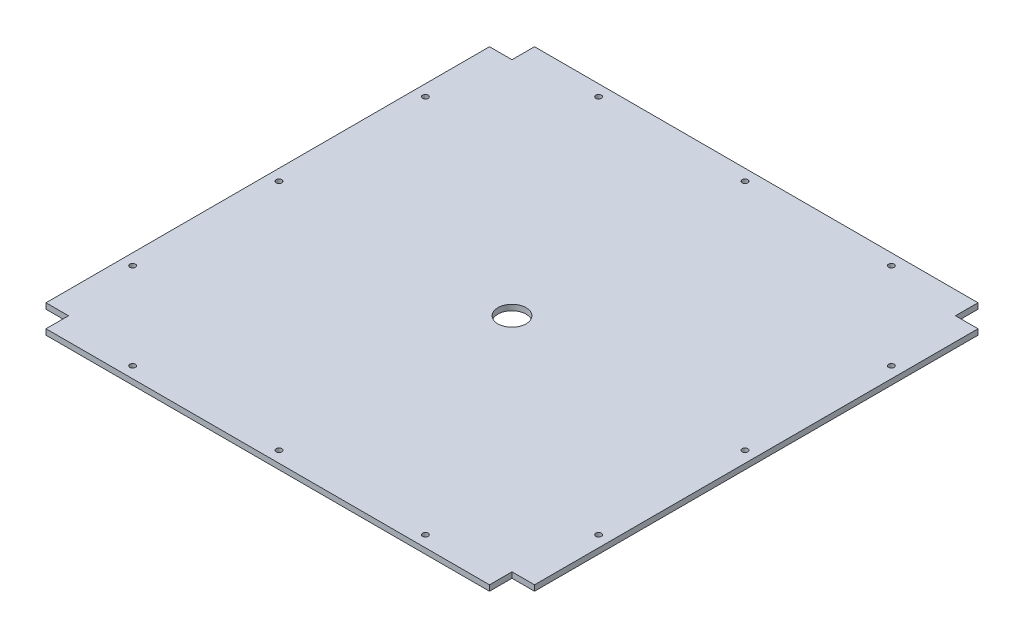
ISO-10303-21;
HEADER;
FILE_DESCRIPTION(('STEP AP214'),'2;1');
FILE_NAME('part.step','',(''),(''),'','','');
FILE_SCHEMA(('AUTOMOTIVE_DESIGN { 1 0 10303 214 1 1 1 1 }'));
ENDSEC;
DATA;
#1=APPLICATION_CONTEXT('core data for automotive mechanical design processes');
#2=APPLICATION_PROTOCOL_DEFINITION('international standard','automotive_design',2000,#1);
#3=PRODUCT_CONTEXT('',#1,'mechanical');
#4=PRODUCT('Part','Part','',(#3));
#5=PRODUCT_RELATED_PRODUCT_CATEGORY('part','',(#4));
#6=PRODUCT_DEFINITION_FORMATION('','',#4);
#7=PRODUCT_DEFINITION_CONTEXT('part definition',#1,'design');
#8=PRODUCT_DEFINITION('design','',#6,#7);
#9=PRODUCT_DEFINITION_SHAPE('','',#8);
#10=(LENGTH_UNIT() NAMED_UNIT(*) SI_UNIT(.MILLI.,.METRE.));
#11=(NAMED_UNIT(*) PLANE_ANGLE_UNIT() SI_UNIT($,.RADIAN.));
#12=(NAMED_UNIT(*) SI_UNIT($,.STERADIAN.) SOLID_ANGLE_UNIT());
#13=UNCERTAINTY_MEASURE_WITH_UNIT(LENGTH_MEASURE(1.E-05),#10,'distance_accuracy_value','');
#14=(GEOMETRIC_REPRESENTATION_CONTEXT(3) GLOBAL_UNCERTAINTY_ASSIGNED_CONTEXT((#13)) GLOBAL_UNIT_ASSIGNED_CONTEXT((#10,
#11,#12)) REPRESENTATION_CONTEXT('',''));
#15=CARTESIAN_POINT('',(0.,0.,0.));
#16=DIRECTION('',(0.,0.,1.));
#17=DIRECTION('',(1.,0.,0.));
#18=AXIS2_PLACEMENT_3D('',#15,#16,#17);
#19=CARTESIAN_POINT('',(0.,5.,0.));
#20=DIRECTION('',(0.,1.,0.));
#21=DIRECTION('',(0.,0.,1.));
#22=AXIS2_PLACEMENT_3D('',#19,#20,#21);
#23=PLANE('',#22);
#24=CARTESIAN_POINT('',(0.,5.,0.));
#25=DIRECTION('',(0.,1.,0.));
#26=DIRECTION('',(0.,0.,1.));
#27=AXIS2_PLACEMENT_3D('',#24,#25,#26);
#28=CIRCLE('',#27,12.5);
#29=CARTESIAN_POINT('',(0.,5.,12.5));
#30=VERTEX_POINT('',#29);
#31=EDGE_CURVE('E234',#30,#30,#28,.T.);
#32=ORIENTED_EDGE('',*,*,#31,.F.);
#33=EDGE_LOOP('',(#32));
#34=FACE_BOUND('',#33,.T.);
#35=CARTESIAN_POINT('',(-6.39469910293642E-13,5.,207.));
#36=DIRECTION('',(0.,-1.,0.));
#37=DIRECTION('',(0.,0.,-1.));
#38=AXIS2_PLACEMENT_3D('',#35,#36,#37);
#39=CIRCLE('',#38,2.5);
#40=CARTESIAN_POINT('',(-6.39469910293642E-13,5.,204.5));
#41=VERTEX_POINT('',#40);
#42=EDGE_CURVE('E275',#41,#41,#39,.T.);
#43=ORIENTED_EDGE('',*,*,#42,.T.);
#44=EDGE_LOOP('',(#43));
#45=FACE_BOUND('',#44,.T.);
#46=CARTESIAN_POINT('',(129.999999999999,5.,207.000000000001));
#47=DIRECTION('',(0.,-1.,0.));
#48=DIRECTION('',(0.,0.,-1.));
#49=AXIS2_PLACEMENT_3D('',#46,#47,#48);
#50=CIRCLE('',#49,2.5);
#51=CARTESIAN_POINT('',(129.999999999999,5.,204.500000000001));
#52=VERTEX_POINT('',#51);
#53=EDGE_CURVE('E283',#52,#52,#50,.T.);
#54=ORIENTED_EDGE('',*,*,#53,.T.);
#55=EDGE_LOOP('',(#54));
#56=FACE_BOUND('',#55,.T.);
#57=CARTESIAN_POINT('',(207.,5.,0.));
#58=DIRECTION('',(0.,-1.,0.));
#59=DIRECTION('',(0.,0.,-1.));
#60=AXIS2_PLACEMENT_3D('',#57,#58,#59);
#61=CIRCLE('',#60,2.5);
#62=CARTESIAN_POINT('',(207.,5.,-2.50000000000008));
#63=VERTEX_POINT('',#62);
#64=EDGE_CURVE('E299',#63,#63,#61,.T.);
#65=ORIENTED_EDGE('',*,*,#64,.T.);
#66=EDGE_LOOP('',(#65));
#67=FACE_BOUND('',#66,.T.);
#68=CARTESIAN_POINT('',(207.,5.,-130.));
#69=DIRECTION('',(0.,-1.,0.));
#70=DIRECTION('',(0.,0.,-1.));
#71=AXIS2_PLACEMENT_3D('',#68,#69,#70);
#72=CIRCLE('',#71,2.5);
#73=CARTESIAN_POINT('',(207.,5.,-132.5));
#74=VERTEX_POINT('',#73);
#75=EDGE_CURVE('E307',#74,#74,#72,.T.);
#76=ORIENTED_EDGE('',*,*,#75,.T.);
#77=EDGE_LOOP('',(#76));
#78=FACE_BOUND('',#77,.T.);
#79=CARTESIAN_POINT('',(-129.999999999999,5.,-207.000000000001));
#80=DIRECTION('',(0.,-1.,0.));
#81=DIRECTION('',(0.,0.,-1.));
#82=AXIS2_PLACEMENT_3D('',#79,#80,#81);
#83=CIRCLE('',#82,2.5);
#84=CARTESIAN_POINT('',(-129.999999999999,5.,-209.500000000001));
#85=VERTEX_POINT('',#84);
#86=EDGE_CURVE('E243',#85,#85,#83,.T.);
#87=ORIENTED_EDGE('',*,*,#86,.T.);
#88=EDGE_LOOP('',(#87));
#89=FACE_BOUND('',#88,.T.);
#90=CARTESIAN_POINT('',(-207.,5.,130.));
#91=DIRECTION('',(0.,-1.,0.));
#92=DIRECTION('',(0.,0.,-1.));
#93=AXIS2_PLACEMENT_3D('',#90,#91,#92);
#94=CIRCLE('',#93,2.5);
#95=CARTESIAN_POINT('',(-207.,5.,127.5));
#96=VERTEX_POINT('',#95);
#97=EDGE_CURVE('E173',#96,#96,#94,.T.);
#98=ORIENTED_EDGE('',*,*,#97,.T.);
#99=EDGE_LOOP('',(#98));
#100=FACE_BOUND('',#99,.T.);
#101=CARTESIAN_POINT('',(-207.,5.,0.));
#102=DIRECTION('',(0.,1.,0.));
#103=DIRECTION('',(0.,0.,1.));
#104=AXIS2_PLACEMENT_3D('',#101,#102,#103);
#105=CIRCLE('',#104,2.5);
#106=CARTESIAN_POINT('',(-207.,5.,2.49999999999991));
#107=VERTEX_POINT('',#106);
#108=EDGE_CURVE('E260',#107,#107,#105,.T.);
#109=ORIENTED_EDGE('',*,*,#108,.F.);
#110=EDGE_LOOP('',(#109));
#111=FACE_BOUND('',#110,.T.);
#112=CARTESIAN_POINT('',(-207.,5.,-130.));
#113=DIRECTION('',(0.,1.,0.));
#114=DIRECTION('',(0.,0.,1.));
#115=AXIS2_PLACEMENT_3D('',#112,#113,#114);
#116=CIRCLE('',#115,2.5);
#117=CARTESIAN_POINT('',(-207.,5.,-127.5));
#118=VERTEX_POINT('',#117);
#119=EDGE_CURVE('E252',#118,#118,#116,.T.);
#120=ORIENTED_EDGE('',*,*,#119,.F.);
#121=EDGE_LOOP('',(#120));
#122=FACE_BOUND('',#121,.T.);
#123=CARTESIAN_POINT('',(8.06003363987416E-13,5.,-207.));
#124=DIRECTION('',(0.,1.,0.));
#125=DIRECTION('',(0.,0.,1.));
#126=AXIS2_PLACEMENT_3D('',#123,#124,#125);
#127=CIRCLE('',#126,2.49999999999999);
#128=CARTESIAN_POINT('',(8.06003363987416E-13,5.,-204.5));
#129=VERTEX_POINT('',#128);
#130=EDGE_CURVE('E323',#129,#129,#127,.T.);
#131=ORIENTED_EDGE('',*,*,#130,.F.);
#132=EDGE_LOOP('',(#131));
#133=FACE_BOUND('',#132,.T.);
#134=CARTESIAN_POINT('',(130.000000000001,5.,-207.));
#135=DIRECTION('',(0.,1.,0.));
#136=DIRECTION('',(0.,0.,1.));
#137=AXIS2_PLACEMENT_3D('',#134,#135,#136);
#138=CIRCLE('',#137,2.5);
#139=CARTESIAN_POINT('',(130.000000000001,5.,-204.5));
#140=VERTEX_POINT('',#139);
#141=EDGE_CURVE('E315',#140,#140,#138,.T.);
#142=ORIENTED_EDGE('',*,*,#141,.F.);
#143=EDGE_LOOP('',(#142));
#144=FACE_BOUND('',#143,.T.);
#145=CARTESIAN_POINT('',(207.,5.,130.));
#146=DIRECTION('',(0.,1.,0.));
#147=DIRECTION('',(0.,0.,1.));
#148=AXIS2_PLACEMENT_3D('',#145,#146,#147);
#149=CIRCLE('',#148,2.5);
#150=CARTESIAN_POINT('',(207.,5.,132.5));
#151=VERTEX_POINT('',#150);
#152=EDGE_CURVE('E291',#151,#151,#149,.T.);
#153=ORIENTED_EDGE('',*,*,#152,.F.);
#154=EDGE_LOOP('',(#153));
#155=FACE_BOUND('',#154,.T.);
#156=CARTESIAN_POINT('',(-130.000000000001,5.,207.));
#157=DIRECTION('',(0.,1.,0.));
#158=DIRECTION('',(0.,0.,1.));
#159=AXIS2_PLACEMENT_3D('',#156,#157,#158);
#160=CIRCLE('',#159,2.5);
#161=CARTESIAN_POINT('',(-130.000000000001,5.,209.5));
#162=VERTEX_POINT('',#161);
#163=EDGE_CURVE('E267',#162,#162,#160,.T.);
#164=ORIENTED_EDGE('',*,*,#163,.F.);
#165=EDGE_LOOP('',(#164));
#166=FACE_BOUND('',#165,.T.);
#167=DIRECTION('',(0.,0.,1.));
#168=VECTOR('',#167,1.);
#169=CARTESIAN_POINT('',(-217.,5.,-217.));
#170=LINE('',#169,#168);
#171=CARTESIAN_POINT('',(-217.,5.,-197.));
#172=VERTEX_POINT('',#171);
#173=CARTESIAN_POINT('',(-217.,5.,196.999999999998));
#174=VERTEX_POINT('',#173);
#175=EDGE_CURVE('E167',#172,#174,#170,.T.);
#176=ORIENTED_EDGE('',*,*,#175,.T.);
#177=DIRECTION('',(1.,0.,0.));
#178=VECTOR('',#177,1.);
#179=CARTESIAN_POINT('',(-2.18713935851156E-12,5.,197.));
#180=LINE('',#179,#178);
#181=CARTESIAN_POINT('',(-197.000000000002,5.,196.999999999998));
#182=VERTEX_POINT('',#181);
#183=EDGE_CURVE('E394',#174,#182,#180,.T.);
#184=ORIENTED_EDGE('',*,*,#183,.T.);
#185=DIRECTION('',(0.,0.,-1.));
#186=VECTOR('',#185,1.);
#187=CARTESIAN_POINT('',(-197.,5.,-2.18713935851156E-12));
#188=LINE('',#187,#186);
#189=CARTESIAN_POINT('',(-197.000000000002,5.,217.));
#190=VERTEX_POINT('',#189);
#191=EDGE_CURVE('E398',#190,#182,#188,.T.);
#192=ORIENTED_EDGE('',*,*,#191,.F.);
#193=DIRECTION('',(1.,0.,0.));
#194=VECTOR('',#193,1.);
#195=CARTESIAN_POINT('',(-217.,5.,217.));
#196=LINE('',#195,#194);
#197=CARTESIAN_POINT('',(196.999999999999,5.,217.));
#198=VERTEX_POINT('',#197);
#199=EDGE_CURVE('E178',#190,#198,#196,.T.);
#200=ORIENTED_EDGE('',*,*,#199,.T.);
#201=DIRECTION('',(0.,0.,-1.));
#202=VECTOR('',#201,1.);
#203=CARTESIAN_POINT('',(197.,5.,1.36696209906973E-12));
#204=LINE('',#203,#202);
#205=CARTESIAN_POINT('',(196.999999999999,5.,197.000000000001));
#206=VERTEX_POINT('',#205);
#207=EDGE_CURVE('E383',#198,#206,#204,.T.);
#208=ORIENTED_EDGE('',*,*,#207,.T.);
#209=DIRECTION('',(-1.,0.,0.));
#210=VECTOR('',#209,1.);
#211=CARTESIAN_POINT('',(-1.36696209906973E-12,5.,197.));
#212=LINE('',#211,#210);
#213=CARTESIAN_POINT('',(217.,5.,197.000000000002));
#214=VERTEX_POINT('',#213);
#215=EDGE_CURVE('E159',#214,#206,#212,.T.);
#216=ORIENTED_EDGE('',*,*,#215,.F.);
#217=DIRECTION('',(0.,0.,-1.));
#218=VECTOR('',#217,1.);
#219=CARTESIAN_POINT('',(217.,5.,-217.));
#220=LINE('',#219,#218);
#221=CARTESIAN_POINT('',(217.,5.,-196.999999999999));
#222=VERTEX_POINT('',#221);
#223=EDGE_CURVE('E150',#214,#222,#220,.T.);
#224=ORIENTED_EDGE('',*,*,#223,.T.);
#225=DIRECTION('',(-1.,0.,0.));
#226=VECTOR('',#225,1.);
#227=CARTESIAN_POINT('',(5.4678483962789E-13,5.,-197.));
#228=LINE('',#227,#226);
#229=CARTESIAN_POINT('',(197.000000000001,5.,-196.999999999999));
#230=VERTEX_POINT('',#229);
#231=EDGE_CURVE('E132',#222,#230,#228,.T.);
#232=ORIENTED_EDGE('',*,*,#231,.T.);
#233=DIRECTION('',(0.,0.,1.));
#234=VECTOR('',#233,1.);
#235=CARTESIAN_POINT('',(197.,5.,5.46784839627891E-13));
#236=LINE('',#235,#234);
#237=CARTESIAN_POINT('',(197.000000000001,5.,-217.));
#238=VERTEX_POINT('',#237);
#239=EDGE_CURVE('E143',#238,#230,#236,.T.);
#240=ORIENTED_EDGE('',*,*,#239,.F.);
#241=DIRECTION('',(-1.,0.,0.));
#242=VECTOR('',#241,1.);
#243=CARTESIAN_POINT('',(-217.,5.,-217.));
#244=LINE('',#243,#242);
#245=CARTESIAN_POINT('',(-197.,5.,-217.));
#246=VERTEX_POINT('',#245);
#247=EDGE_CURVE('E161',#238,#246,#244,.T.);
#248=ORIENTED_EDGE('',*,*,#247,.T.);
#249=DIRECTION('',(0.,0.,1.));
#250=VECTOR('',#249,1.);
#251=CARTESIAN_POINT('',(-197.,5.,0.));
#252=LINE('',#251,#250);
#253=CARTESIAN_POINT('',(-197.,5.,-197.));
#254=VERTEX_POINT('',#253);
#255=EDGE_CURVE('E377',#246,#254,#252,.T.);
#256=ORIENTED_EDGE('',*,*,#255,.T.);
#257=DIRECTION('',(1.,0.,0.));
#258=VECTOR('',#257,1.);
#259=CARTESIAN_POINT('',(0.,5.,-197.));
#260=LINE('',#259,#258);
#261=EDGE_CURVE('E409',#172,#254,#260,.T.);
#262=ORIENTED_EDGE('',*,*,#261,.F.);
#263=EDGE_LOOP('',(#176,#184,#192,#200,#208,#216,#224,#232,#240,#248,#256,#262));
#264=FACE_BOUND('',#263,.T.);
#265=ADVANCED_FACE('F42',(#34,#45,#56,#67,#78,#89,#100,#111,#122,#133,#144,#155,#166,#264),#23,.T.);
#266=CARTESIAN_POINT('',(0.,0.,0.));
#267=DIRECTION('',(0.,1.,0.));
#268=DIRECTION('',(0.,0.,1.));
#269=AXIS2_PLACEMENT_3D('',#266,#267,#268);
#270=PLANE('',#269);
#271=CARTESIAN_POINT('',(0.,0.,0.));
#272=DIRECTION('',(0.,1.,0.));
#273=DIRECTION('',(0.,0.,1.));
#274=AXIS2_PLACEMENT_3D('',#271,#272,#273);
#275=CIRCLE('',#274,12.5);
#276=CARTESIAN_POINT('',(0.,0.,12.5));
#277=VERTEX_POINT('',#276);
#278=EDGE_CURVE('E235',#277,#277,#275,.T.);
#279=ORIENTED_EDGE('',*,*,#278,.T.);
#280=EDGE_LOOP('',(#279));
#281=FACE_BOUND('',#280,.T.);
#282=CARTESIAN_POINT('',(207.,0.,130.));
#283=DIRECTION('',(0.,1.,0.));
#284=DIRECTION('',(0.,0.,1.));
#285=AXIS2_PLACEMENT_3D('',#282,#283,#284);
#286=CIRCLE('',#285,2.5);
#287=CARTESIAN_POINT('',(207.,0.,132.5));
#288=VERTEX_POINT('',#287);
#289=EDGE_CURVE('E295',#288,#288,#286,.T.);
#290=ORIENTED_EDGE('',*,*,#289,.T.);
#291=EDGE_LOOP('',(#290));
#292=FACE_BOUND('',#291,.T.);
#293=CARTESIAN_POINT('',(207.,0.,0.));
#294=DIRECTION('',(0.,-1.,0.));
#295=DIRECTION('',(0.,0.,-1.));
#296=AXIS2_PLACEMENT_3D('',#293,#294,#295);
#297=CIRCLE('',#296,2.5);
#298=CARTESIAN_POINT('',(207.,0.,-2.50000000000008));
#299=VERTEX_POINT('',#298);
#300=EDGE_CURVE('E303',#299,#299,#297,.T.);
#301=ORIENTED_EDGE('',*,*,#300,.F.);
#302=EDGE_LOOP('',(#301));
#303=FACE_BOUND('',#302,.T.);
#304=CARTESIAN_POINT('',(207.,0.,-130.));
#305=DIRECTION('',(0.,-1.,0.));
#306=DIRECTION('',(0.,0.,-1.));
#307=AXIS2_PLACEMENT_3D('',#304,#305,#306);
#308=CIRCLE('',#307,2.5);
#309=CARTESIAN_POINT('',(207.,0.,-132.5));
#310=VERTEX_POINT('',#309);
#311=EDGE_CURVE('E311',#310,#310,#308,.T.);
#312=ORIENTED_EDGE('',*,*,#311,.F.);
#313=EDGE_LOOP('',(#312));
#314=FACE_BOUND('',#313,.T.);
#315=CARTESIAN_POINT('',(8.06003363987416E-13,0.,-207.));
#316=DIRECTION('',(0.,1.,0.));
#317=DIRECTION('',(0.,0.,1.));
#318=AXIS2_PLACEMENT_3D('',#315,#316,#317);
#319=CIRCLE('',#318,2.49999999999999);
#320=CARTESIAN_POINT('',(8.06003363987416E-13,0.,-204.5));
#321=VERTEX_POINT('',#320);
#322=EDGE_CURVE('E247',#321,#321,#319,.T.);
#323=ORIENTED_EDGE('',*,*,#322,.T.);
#324=EDGE_LOOP('',(#323));
#325=FACE_BOUND('',#324,.T.);
#326=CARTESIAN_POINT('',(-129.999999999999,0.,-207.000000000001));
#327=DIRECTION('',(0.,-1.,0.));
#328=DIRECTION('',(0.,0.,-1.));
#329=AXIS2_PLACEMENT_3D('',#326,#327,#328);
#330=CIRCLE('',#329,2.5);
#331=CARTESIAN_POINT('',(-129.999999999999,0.,-209.500000000001));
#332=VERTEX_POINT('',#331);
#333=EDGE_CURVE('E248',#332,#332,#330,.T.);
#334=ORIENTED_EDGE('',*,*,#333,.F.);
#335=EDGE_LOOP('',(#334));
#336=FACE_BOUND('',#335,.T.);
#337=CARTESIAN_POINT('',(-207.,0.,0.));
#338=DIRECTION('',(0.,1.,0.));
#339=DIRECTION('',(0.,0.,1.));
#340=AXIS2_PLACEMENT_3D('',#337,#338,#339);
#341=CIRCLE('',#340,2.5);
#342=CARTESIAN_POINT('',(-207.,0.,2.49999999999991));
#343=VERTEX_POINT('',#342);
#344=EDGE_CURVE('E239',#343,#343,#341,.T.);
#345=ORIENTED_EDGE('',*,*,#344,.T.);
#346=EDGE_LOOP('',(#345));
#347=FACE_BOUND('',#346,.T.);
#348=CARTESIAN_POINT('',(-207.,0.,130.));
#349=DIRECTION('',(0.,-1.,0.));
#350=DIRECTION('',(0.,0.,-1.));
#351=AXIS2_PLACEMENT_3D('',#348,#349,#350);
#352=CIRCLE('',#351,2.5);
#353=CARTESIAN_POINT('',(-207.,0.,127.5));
#354=VERTEX_POINT('',#353);
#355=EDGE_CURVE('E186',#354,#354,#352,.T.);
#356=ORIENTED_EDGE('',*,*,#355,.F.);
#357=EDGE_LOOP('',(#356));
#358=FACE_BOUND('',#357,.T.);
#359=CARTESIAN_POINT('',(-207.,0.,-130.));
#360=DIRECTION('',(0.,1.,0.));
#361=DIRECTION('',(0.,0.,1.));
#362=AXIS2_PLACEMENT_3D('',#359,#360,#361);
#363=CIRCLE('',#362,2.5);
#364=CARTESIAN_POINT('',(-207.,0.,-127.5));
#365=VERTEX_POINT('',#364);
#366=EDGE_CURVE('E256',#365,#365,#363,.T.);
#367=ORIENTED_EDGE('',*,*,#366,.T.);
#368=EDGE_LOOP('',(#367));
#369=FACE_BOUND('',#368,.T.);
#370=CARTESIAN_POINT('',(130.000000000001,0.,-207.));
#371=DIRECTION('',(0.,1.,0.));
#372=DIRECTION('',(0.,0.,1.));
#373=AXIS2_PLACEMENT_3D('',#370,#371,#372);
#374=CIRCLE('',#373,2.5);
#375=CARTESIAN_POINT('',(130.000000000001,0.,-204.5));
#376=VERTEX_POINT('',#375);
#377=EDGE_CURVE('E319',#376,#376,#374,.T.);
#378=ORIENTED_EDGE('',*,*,#377,.T.);
#379=EDGE_LOOP('',(#378));
#380=FACE_BOUND('',#379,.T.);
#381=CARTESIAN_POINT('',(129.999999999999,0.,207.000000000001));
#382=DIRECTION('',(0.,-1.,0.));
#383=DIRECTION('',(0.,0.,-1.));
#384=AXIS2_PLACEMENT_3D('',#381,#382,#383);
#385=CIRCLE('',#384,2.5);
#386=CARTESIAN_POINT('',(129.999999999999,0.,204.500000000001));
#387=VERTEX_POINT('',#386);
#388=EDGE_CURVE('E287',#387,#387,#385,.T.);
#389=ORIENTED_EDGE('',*,*,#388,.F.);
#390=EDGE_LOOP('',(#389));
#391=FACE_BOUND('',#390,.T.);
#392=CARTESIAN_POINT('',(-6.39469910293642E-13,0.,207.));
#393=DIRECTION('',(0.,-1.,0.));
#394=DIRECTION('',(0.,0.,-1.));
#395=AXIS2_PLACEMENT_3D('',#392,#393,#394);
#396=CIRCLE('',#395,2.5);
#397=CARTESIAN_POINT('',(-6.39469910293642E-13,0.,204.5));
#398=VERTEX_POINT('',#397);
#399=EDGE_CURVE('E279',#398,#398,#396,.T.);
#400=ORIENTED_EDGE('',*,*,#399,.F.);
#401=EDGE_LOOP('',(#400));
#402=FACE_BOUND('',#401,.T.);
#403=CARTESIAN_POINT('',(-130.000000000001,0.,207.));
#404=DIRECTION('',(0.,1.,0.));
#405=DIRECTION('',(0.,0.,1.));
#406=AXIS2_PLACEMENT_3D('',#403,#404,#405);
#407=CIRCLE('',#406,2.5);
#408=CARTESIAN_POINT('',(-130.000000000001,0.,209.5));
#409=VERTEX_POINT('',#408);
#410=EDGE_CURVE('E271',#409,#409,#407,.T.);
#411=ORIENTED_EDGE('',*,*,#410,.T.);
#412=EDGE_LOOP('',(#411));
#413=FACE_BOUND('',#412,.T.);
#414=DIRECTION('',(1.,0.,0.));
#415=VECTOR('',#414,1.);
#416=CARTESIAN_POINT('',(-2.18713935851156E-12,0.,197.));
#417=LINE('',#416,#415);
#418=CARTESIAN_POINT('',(-217.,0.,196.999999999998));
#419=VERTEX_POINT('',#418);
#420=CARTESIAN_POINT('',(-197.000000000002,0.,196.999999999998));
#421=VERTEX_POINT('',#420);
#422=EDGE_CURVE('E211',#419,#421,#417,.T.);
#423=ORIENTED_EDGE('',*,*,#422,.F.);
#424=DIRECTION('',(0.,0.,1.));
#425=VECTOR('',#424,1.);
#426=CARTESIAN_POINT('',(-217.,0.,-217.));
#427=LINE('',#426,#425);
#428=CARTESIAN_POINT('',(-217.,0.,-197.));
#429=VERTEX_POINT('',#428);
#430=EDGE_CURVE('E170',#429,#419,#427,.T.);
#431=ORIENTED_EDGE('',*,*,#430,.F.);
#432=DIRECTION('',(1.,0.,0.));
#433=VECTOR('',#432,1.);
#434=CARTESIAN_POINT('',(0.,0.,-197.));
#435=LINE('',#434,#433);
#436=CARTESIAN_POINT('',(-197.,0.,-197.));
#437=VERTEX_POINT('',#436);
#438=EDGE_CURVE('E65',#429,#437,#435,.T.);
#439=ORIENTED_EDGE('',*,*,#438,.T.);
#440=DIRECTION('',(0.,0.,1.));
#441=VECTOR('',#440,1.);
#442=CARTESIAN_POINT('',(-197.,0.,0.));
#443=LINE('',#442,#441);
#444=CARTESIAN_POINT('',(-197.,0.,-217.));
#445=VERTEX_POINT('',#444);
#446=EDGE_CURVE('E217',#445,#437,#443,.T.);
#447=ORIENTED_EDGE('',*,*,#446,.F.);
#448=DIRECTION('',(-1.,0.,0.));
#449=VECTOR('',#448,1.);
#450=CARTESIAN_POINT('',(-217.,0.,-217.));
#451=LINE('',#450,#449);
#452=CARTESIAN_POINT('',(197.000000000001,0.,-217.));
#453=VERTEX_POINT('',#452);
#454=EDGE_CURVE('E185',#453,#445,#451,.T.);
#455=ORIENTED_EDGE('',*,*,#454,.F.);
#456=DIRECTION('',(0.,0.,1.));
#457=VECTOR('',#456,1.);
#458=CARTESIAN_POINT('',(197.,0.,5.46784839627891E-13));
#459=LINE('',#458,#457);
#460=CARTESIAN_POINT('',(197.000000000001,0.,-196.999999999999));
#461=VERTEX_POINT('',#460);
#462=EDGE_CURVE('E58',#453,#461,#459,.T.);
#463=ORIENTED_EDGE('',*,*,#462,.T.);
#464=DIRECTION('',(-1.,0.,0.));
#465=VECTOR('',#464,1.);
#466=CARTESIAN_POINT('',(5.4678483962789E-13,0.,-197.));
#467=LINE('',#466,#465);
#468=CARTESIAN_POINT('',(217.,0.,-196.999999999999));
#469=VERTEX_POINT('',#468);
#470=EDGE_CURVE('E227',#469,#461,#467,.T.);
#471=ORIENTED_EDGE('',*,*,#470,.F.);
#472=DIRECTION('',(0.,0.,-1.));
#473=VECTOR('',#472,1.);
#474=CARTESIAN_POINT('',(217.,0.,-217.));
#475=LINE('',#474,#473);
#476=CARTESIAN_POINT('',(217.,0.,197.000000000002));
#477=VERTEX_POINT('',#476);
#478=EDGE_CURVE('E152',#477,#469,#475,.T.);
#479=ORIENTED_EDGE('',*,*,#478,.F.);
#480=DIRECTION('',(-1.,0.,0.));
#481=VECTOR('',#480,1.);
#482=CARTESIAN_POINT('',(-1.36696209906973E-12,0.,197.));
#483=LINE('',#482,#481);
#484=CARTESIAN_POINT('',(196.999999999999,0.,197.000000000001));
#485=VERTEX_POINT('',#484);
#486=EDGE_CURVE('E230',#477,#485,#483,.T.);
#487=ORIENTED_EDGE('',*,*,#486,.T.);
#488=DIRECTION('',(0.,0.,-1.));
#489=VECTOR('',#488,1.);
#490=CARTESIAN_POINT('',(197.,0.,1.36696209906973E-12));
#491=LINE('',#490,#489);
#492=CARTESIAN_POINT('',(196.999999999999,0.,217.));
#493=VERTEX_POINT('',#492);
#494=EDGE_CURVE('E415',#493,#485,#491,.T.);
#495=ORIENTED_EDGE('',*,*,#494,.F.);
#496=DIRECTION('',(1.,0.,0.));
#497=VECTOR('',#496,1.);
#498=CARTESIAN_POINT('',(-217.,0.,217.));
#499=LINE('',#498,#497);
#500=CARTESIAN_POINT('',(-197.000000000002,0.,217.));
#501=VERTEX_POINT('',#500);
#502=EDGE_CURVE('E162',#501,#493,#499,.T.);
#503=ORIENTED_EDGE('',*,*,#502,.F.);
#504=DIRECTION('',(0.,0.,-1.));
#505=VECTOR('',#504,1.);
#506=CARTESIAN_POINT('',(-197.,0.,-2.18713935851156E-12));
#507=LINE('',#506,#505);
#508=EDGE_CURVE('E213',#501,#421,#507,.T.);
#509=ORIENTED_EDGE('',*,*,#508,.T.);
#510=EDGE_LOOP('',(#423,#431,#439,#447,#455,#463,#471,#479,#487,#495,#503,#509));
#511=FACE_BOUND('',#510,.T.);
#512=ADVANCED_FACE('F208',(#281,#292,#303,#314,#325,#336,#347,#358,#369,#380,#391,#402,#413,
#511),#270,.F.);
#513=CARTESIAN_POINT('',(217.,5.,-217.));
#514=DIRECTION('',(-1.,0.,0.));
#515=DIRECTION('',(0.,0.,1.));
#516=AXIS2_PLACEMENT_3D('',#513,#514,#515);
#517=PLANE('',#516);
#518=ORIENTED_EDGE('',*,*,#223,.F.);
#519=DIRECTION('',(0.,1.,0.));
#520=VECTOR('',#519,1.);
#521=CARTESIAN_POINT('',(217.,-5.,197.000000000002));
#522=LINE('',#521,#520);
#523=EDGE_CURVE('E389',#477,#214,#522,.T.);
#524=ORIENTED_EDGE('',*,*,#523,.F.);
#525=ORIENTED_EDGE('',*,*,#478,.T.);
#526=DIRECTION('',(0.,1.,0.));
#527=VECTOR('',#526,1.);
#528=CARTESIAN_POINT('',(217.,-5.,-196.999999999999));
#529=LINE('',#528,#527);
#530=EDGE_CURVE('E135',#469,#222,#529,.T.);
#531=ORIENTED_EDGE('',*,*,#530,.T.);
#532=EDGE_LOOP('',(#518,#524,#525,#531));
#533=FACE_BOUND('',#532,.T.);
#534=ADVANCED_FACE('F44',(#533),#517,.F.);
#535=CARTESIAN_POINT('',(-217.,5.,-217.));
#536=DIRECTION('',(0.,0.,1.));
#537=DIRECTION('',(1.,0.,0.));
#538=AXIS2_PLACEMENT_3D('',#535,#536,#537);
#539=PLANE('',#538);
#540=ORIENTED_EDGE('',*,*,#247,.F.);
#541=DIRECTION('',(0.,-1.,0.));
#542=VECTOR('',#541,1.);
#543=CARTESIAN_POINT('',(197.000000000001,5.,-217.));
#544=LINE('',#543,#542);
#545=EDGE_CURVE('E11',#238,#453,#544,.T.);
#546=ORIENTED_EDGE('',*,*,#545,.T.);
#547=ORIENTED_EDGE('',*,*,#454,.T.);
#548=DIRECTION('',(0.,1.,0.));
#549=VECTOR('',#548,1.);
#550=CARTESIAN_POINT('',(-197.,-5.,-217.));
#551=LINE('',#550,#549);
#552=EDGE_CURVE('E375',#445,#246,#551,.T.);
#553=ORIENTED_EDGE('',*,*,#552,.T.);
#554=EDGE_LOOP('',(#540,#546,#547,#553));
#555=FACE_BOUND('',#554,.T.);
#556=ADVANCED_FACE('F366',(#555),#539,.F.);
#557=CARTESIAN_POINT('',(-217.,5.,-217.));
#558=DIRECTION('',(1.,0.,0.));
#559=DIRECTION('',(0.,0.,-1.));
#560=AXIS2_PLACEMENT_3D('',#557,#558,#559);
#561=PLANE('',#560);
#562=DIRECTION('',(0.,1.,0.));
#563=VECTOR('',#562,1.);
#564=CARTESIAN_POINT('',(-217.,-5.,196.999999999998));
#565=LINE('',#564,#563);
#566=EDGE_CURVE('E402',#419,#174,#565,.T.);
#567=ORIENTED_EDGE('',*,*,#566,.T.);
#568=ORIENTED_EDGE('',*,*,#175,.F.);
#569=DIRECTION('',(0.,-1.,0.));
#570=VECTOR('',#569,1.);
#571=CARTESIAN_POINT('',(-217.,5.,-197.));
#572=LINE('',#571,#570);
#573=EDGE_CURVE('E51',#172,#429,#572,.T.);
#574=ORIENTED_EDGE('',*,*,#573,.T.);
#575=ORIENTED_EDGE('',*,*,#430,.T.);
#576=EDGE_LOOP('',(#567,#568,#574,#575));
#577=FACE_BOUND('',#576,.T.);
#578=ADVANCED_FACE('F203',(#577),#561,.F.);
#579=CARTESIAN_POINT('',(-217.,5.,217.));
#580=DIRECTION('',(0.,0.,-1.));
#581=DIRECTION('',(-1.,0.,0.));
#582=AXIS2_PLACEMENT_3D('',#579,#580,#581);
#583=PLANE('',#582);
#584=ORIENTED_EDGE('',*,*,#199,.F.);
#585=DIRECTION('',(0.,-1.,0.));
#586=VECTOR('',#585,1.);
#587=CARTESIAN_POINT('',(-197.000000000002,5.,217.));
#588=LINE('',#587,#586);
#589=EDGE_CURVE('E195',#190,#501,#588,.T.);
#590=ORIENTED_EDGE('',*,*,#589,.T.);
#591=ORIENTED_EDGE('',*,*,#502,.T.);
#592=DIRECTION('',(0.,-1.,0.));
#593=VECTOR('',#592,1.);
#594=CARTESIAN_POINT('',(196.999999999999,5.,217.));
#595=LINE('',#594,#593);
#596=EDGE_CURVE('E182',#198,#493,#595,.T.);
#597=ORIENTED_EDGE('',*,*,#596,.F.);
#598=EDGE_LOOP('',(#584,#590,#591,#597));
#599=FACE_BOUND('',#598,.T.);
#600=ADVANCED_FACE('F342',(#599),#583,.F.);
#601=CARTESIAN_POINT('',(-207.,0.,130.));
#602=DIRECTION('',(0.,1.,0.));
#603=DIRECTION('',(0.,0.,1.));
#604=AXIS2_PLACEMENT_3D('',#601,#602,#603);
#605=CYLINDRICAL_SURFACE('',#604,2.5);
#606=ORIENTED_EDGE('',*,*,#355,.T.);
#607=EDGE_LOOP('',(#606));
#608=FACE_BOUND('',#607,.T.);
#609=ORIENTED_EDGE('',*,*,#97,.F.);
#610=EDGE_LOOP('',(#609));
#611=FACE_BOUND('',#610,.T.);
#612=ADVANCED_FACE('F339',(#608,#611),#605,.F.);
#613=CARTESIAN_POINT('',(-207.,0.,0.));
#614=DIRECTION('',(0.,1.,0.));
#615=DIRECTION('',(0.,0.,1.));
#616=AXIS2_PLACEMENT_3D('',#613,#614,#615);
#617=CYLINDRICAL_SURFACE('',#616,2.5);
#618=ORIENTED_EDGE('',*,*,#344,.F.);
#619=EDGE_LOOP('',(#618));
#620=FACE_BOUND('',#619,.T.);
#621=ORIENTED_EDGE('',*,*,#108,.T.);
#622=EDGE_LOOP('',(#621));
#623=FACE_BOUND('',#622,.T.);
#624=ADVANCED_FACE('F341',(#620,#623),#617,.F.);
#625=CARTESIAN_POINT('',(-207.,0.,-130.));
#626=DIRECTION('',(0.,1.,0.));
#627=DIRECTION('',(0.,0.,1.));
#628=AXIS2_PLACEMENT_3D('',#625,#626,#627);
#629=CYLINDRICAL_SURFACE('',#628,2.5);
#630=ORIENTED_EDGE('',*,*,#366,.F.);
#631=EDGE_LOOP('',(#630));
#632=FACE_BOUND('',#631,.T.);
#633=ORIENTED_EDGE('',*,*,#119,.T.);
#634=EDGE_LOOP('',(#633));
#635=FACE_BOUND('',#634,.T.);
#636=ADVANCED_FACE('F348',(#632,#635),#629,.F.);
#637=CARTESIAN_POINT('',(-129.999999999999,0.,-207.000000000001));
#638=DIRECTION('',(0.,1.,0.));
#639=DIRECTION('',(0.,0.,1.));
#640=AXIS2_PLACEMENT_3D('',#637,#638,#639);
#641=CYLINDRICAL_SURFACE('',#640,2.5);
#642=ORIENTED_EDGE('',*,*,#333,.T.);
#643=EDGE_LOOP('',(#642));
#644=FACE_BOUND('',#643,.T.);
#645=ORIENTED_EDGE('',*,*,#86,.F.);
#646=EDGE_LOOP('',(#645));
#647=FACE_BOUND('',#646,.T.);
#648=ADVANCED_FACE('F458',(#644,#647),#641,.F.);
#649=CARTESIAN_POINT('',(8.06003363987416E-13,0.,-207.));
#650=DIRECTION('',(0.,1.,0.));
#651=DIRECTION('',(0.,0.,1.));
#652=AXIS2_PLACEMENT_3D('',#649,#650,#651);
#653=CYLINDRICAL_SURFACE('',#652,2.49999999999999);
#654=ORIENTED_EDGE('',*,*,#322,.F.);
#655=EDGE_LOOP('',(#654));
#656=FACE_BOUND('',#655,.T.);
#657=ORIENTED_EDGE('',*,*,#130,.T.);
#658=EDGE_LOOP('',(#657));
#659=FACE_BOUND('',#658,.T.);
#660=ADVANCED_FACE('F461',(#656,#659),#653,.F.);
#661=CARTESIAN_POINT('',(130.000000000001,0.,-207.));
#662=DIRECTION('',(0.,1.,0.));
#663=DIRECTION('',(0.,0.,1.));
#664=AXIS2_PLACEMENT_3D('',#661,#662,#663);
#665=CYLINDRICAL_SURFACE('',#664,2.5);
#666=ORIENTED_EDGE('',*,*,#377,.F.);
#667=EDGE_LOOP('',(#666));
#668=FACE_BOUND('',#667,.T.);
#669=ORIENTED_EDGE('',*,*,#141,.T.);
#670=EDGE_LOOP('',(#669));
#671=FACE_BOUND('',#670,.T.);
#672=ADVANCED_FACE('F488',(#668,#671),#665,.F.);
#673=CARTESIAN_POINT('',(207.,0.,-130.));
#674=DIRECTION('',(0.,1.,0.));
#675=DIRECTION('',(0.,0.,1.));
#676=AXIS2_PLACEMENT_3D('',#673,#674,#675);
#677=CYLINDRICAL_SURFACE('',#676,2.5);
#678=ORIENTED_EDGE('',*,*,#311,.T.);
#679=EDGE_LOOP('',(#678));
#680=FACE_BOUND('',#679,.T.);
#681=ORIENTED_EDGE('',*,*,#75,.F.);
#682=EDGE_LOOP('',(#681));
#683=FACE_BOUND('',#682,.T.);
#684=ADVANCED_FACE('F484',(#680,#683),#677,.F.);
#685=CARTESIAN_POINT('',(207.,0.,0.));
#686=DIRECTION('',(0.,1.,0.));
#687=DIRECTION('',(0.,0.,1.));
#688=AXIS2_PLACEMENT_3D('',#685,#686,#687);
#689=CYLINDRICAL_SURFACE('',#688,2.5);
#690=ORIENTED_EDGE('',*,*,#300,.T.);
#691=EDGE_LOOP('',(#690));
#692=FACE_BOUND('',#691,.T.);
#693=ORIENTED_EDGE('',*,*,#64,.F.);
#694=EDGE_LOOP('',(#693));
#695=FACE_BOUND('',#694,.T.);
#696=ADVANCED_FACE('F480',(#692,#695),#689,.F.);
#697=CARTESIAN_POINT('',(207.,0.,130.));
#698=DIRECTION('',(0.,1.,0.));
#699=DIRECTION('',(0.,0.,1.));
#700=AXIS2_PLACEMENT_3D('',#697,#698,#699);
#701=CYLINDRICAL_SURFACE('',#700,2.5);
#702=ORIENTED_EDGE('',*,*,#289,.F.);
#703=EDGE_LOOP('',(#702));
#704=FACE_BOUND('',#703,.T.);
#705=ORIENTED_EDGE('',*,*,#152,.T.);
#706=EDGE_LOOP('',(#705));
#707=FACE_BOUND('',#706,.T.);
#708=ADVANCED_FACE('F476',(#704,#707),#701,.F.);
#709=CARTESIAN_POINT('',(129.999999999999,0.,207.000000000001));
#710=DIRECTION('',(0.,1.,0.));
#711=DIRECTION('',(0.,0.,1.));
#712=AXIS2_PLACEMENT_3D('',#709,#710,#711);
#713=CYLINDRICAL_SURFACE('',#712,2.5);
#714=ORIENTED_EDGE('',*,*,#388,.T.);
#715=EDGE_LOOP('',(#714));
#716=FACE_BOUND('',#715,.T.);
#717=ORIENTED_EDGE('',*,*,#53,.F.);
#718=EDGE_LOOP('',(#717));
#719=FACE_BOUND('',#718,.T.);
#720=ADVANCED_FACE('F472',(#716,#719),#713,.F.);
#721=CARTESIAN_POINT('',(-6.39469910293642E-13,0.,207.));
#722=DIRECTION('',(0.,1.,0.));
#723=DIRECTION('',(0.,0.,1.));
#724=AXIS2_PLACEMENT_3D('',#721,#722,#723);
#725=CYLINDRICAL_SURFACE('',#724,2.5);
#726=ORIENTED_EDGE('',*,*,#399,.T.);
#727=EDGE_LOOP('',(#726));
#728=FACE_BOUND('',#727,.T.);
#729=ORIENTED_EDGE('',*,*,#42,.F.);
#730=EDGE_LOOP('',(#729));
#731=FACE_BOUND('',#730,.T.);
#732=ADVANCED_FACE('F468',(#728,#731),#725,.F.);
#733=CARTESIAN_POINT('',(-130.000000000001,0.,207.));
#734=DIRECTION('',(0.,1.,0.));
#735=DIRECTION('',(0.,0.,1.));
#736=AXIS2_PLACEMENT_3D('',#733,#734,#735);
#737=CYLINDRICAL_SURFACE('',#736,2.5);
#738=ORIENTED_EDGE('',*,*,#410,.F.);
#739=EDGE_LOOP('',(#738));
#740=FACE_BOUND('',#739,.T.);
#741=ORIENTED_EDGE('',*,*,#163,.T.);
#742=EDGE_LOOP('',(#741));
#743=FACE_BOUND('',#742,.T.);
#744=ADVANCED_FACE('F456',(#740,#743),#737,.F.);
#745=CARTESIAN_POINT('',(0.,0.,0.));
#746=DIRECTION('',(0.,1.,0.));
#747=DIRECTION('',(0.,0.,1.));
#748=AXIS2_PLACEMENT_3D('',#745,#746,#747);
#749=CYLINDRICAL_SURFACE('',#748,12.5);
#750=ORIENTED_EDGE('',*,*,#278,.F.);
#751=EDGE_LOOP('',(#750));
#752=FACE_BOUND('',#751,.T.);
#753=ORIENTED_EDGE('',*,*,#31,.T.);
#754=EDGE_LOOP('',(#753));
#755=FACE_BOUND('',#754,.T.);
#756=ADVANCED_FACE('F438',(#752,#755),#749,.F.);
#757=CARTESIAN_POINT('',(-1.36696209906973E-12,-5.,197.));
#758=DIRECTION('',(0.,0.,-1.));
#759=DIRECTION('',(-1.,0.,0.));
#760=AXIS2_PLACEMENT_3D('',#757,#758,#759);
#761=PLANE('',#760);
#762=ORIENTED_EDGE('',*,*,#523,.T.);
#763=ORIENTED_EDGE('',*,*,#215,.T.);
#764=DIRECTION('',(0.,1.,0.));
#765=VECTOR('',#764,1.);
#766=CARTESIAN_POINT('',(196.999999999999,-5.,197.000000000001));
#767=LINE('',#766,#765);
#768=EDGE_CURVE('E144',#485,#206,#767,.T.);
#769=ORIENTED_EDGE('',*,*,#768,.F.);
#770=ORIENTED_EDGE('',*,*,#486,.F.);
#771=EDGE_LOOP('',(#762,#763,#769,#770));
#772=FACE_BOUND('',#771,.T.);
#773=ADVANCED_FACE('F426',(#772),#761,.F.);
#774=CARTESIAN_POINT('',(197.,-5.,1.36696209906973E-12));
#775=DIRECTION('',(1.,0.,0.));
#776=DIRECTION('',(0.,0.,-1.));
#777=AXIS2_PLACEMENT_3D('',#774,#775,#776);
#778=PLANE('',#777);
#779=ORIENTED_EDGE('',*,*,#494,.T.);
#780=ORIENTED_EDGE('',*,*,#768,.T.);
#781=ORIENTED_EDGE('',*,*,#207,.F.);
#782=ORIENTED_EDGE('',*,*,#596,.T.);
#783=EDGE_LOOP('',(#779,#780,#781,#782));
#784=FACE_BOUND('',#783,.T.);
#785=ADVANCED_FACE('F423',(#784),#778,.T.);
#786=CARTESIAN_POINT('',(-2.18713935851156E-12,-5.,197.));
#787=DIRECTION('',(0.,0.,1.));
#788=DIRECTION('',(1.,0.,0.));
#789=AXIS2_PLACEMENT_3D('',#786,#787,#788);
#790=PLANE('',#789);
#791=ORIENTED_EDGE('',*,*,#422,.T.);
#792=DIRECTION('',(0.,1.,0.));
#793=VECTOR('',#792,1.);
#794=CARTESIAN_POINT('',(-197.000000000002,-5.,196.999999999998));
#795=LINE('',#794,#793);
#796=EDGE_CURVE('E386',#421,#182,#795,.T.);
#797=ORIENTED_EDGE('',*,*,#796,.T.);
#798=ORIENTED_EDGE('',*,*,#183,.F.);
#799=ORIENTED_EDGE('',*,*,#566,.F.);
#800=EDGE_LOOP('',(#791,#797,#798,#799));
#801=FACE_BOUND('',#800,.T.);
#802=ADVANCED_FACE('F441',(#801),#790,.T.);
#803=CARTESIAN_POINT('',(-197.,-5.,-2.18713935851156E-12));
#804=DIRECTION('',(1.,0.,0.));
#805=DIRECTION('',(0.,0.,-1.));
#806=AXIS2_PLACEMENT_3D('',#803,#804,#805);
#807=PLANE('',#806);
#808=ORIENTED_EDGE('',*,*,#589,.F.);
#809=ORIENTED_EDGE('',*,*,#191,.T.);
#810=ORIENTED_EDGE('',*,*,#796,.F.);
#811=ORIENTED_EDGE('',*,*,#508,.F.);
#812=EDGE_LOOP('',(#808,#809,#810,#811));
#813=FACE_BOUND('',#812,.T.);
#814=ADVANCED_FACE('F442',(#813),#807,.F.);
#815=CARTESIAN_POINT('',(-197.,-5.,0.));
#816=DIRECTION('',(-1.,0.,0.));
#817=DIRECTION('',(0.,0.,1.));
#818=AXIS2_PLACEMENT_3D('',#815,#816,#817);
#819=PLANE('',#818);
#820=ORIENTED_EDGE('',*,*,#446,.T.);
#821=DIRECTION('',(0.,1.,0.));
#822=VECTOR('',#821,1.);
#823=CARTESIAN_POINT('',(-197.,-5.,-197.));
#824=LINE('',#823,#822);
#825=EDGE_CURVE('E412',#437,#254,#824,.T.);
#826=ORIENTED_EDGE('',*,*,#825,.T.);
#827=ORIENTED_EDGE('',*,*,#255,.F.);
#828=ORIENTED_EDGE('',*,*,#552,.F.);
#829=EDGE_LOOP('',(#820,#826,#827,#828));
#830=FACE_BOUND('',#829,.T.);
#831=ADVANCED_FACE('F445',(#830),#819,.T.);
#832=CARTESIAN_POINT('',(0.,-5.,-197.));
#833=DIRECTION('',(0.,0.,1.));
#834=DIRECTION('',(1.,0.,0.));
#835=AXIS2_PLACEMENT_3D('',#832,#833,#834);
#836=PLANE('',#835);
#837=ORIENTED_EDGE('',*,*,#573,.F.);
#838=ORIENTED_EDGE('',*,*,#261,.T.);
#839=ORIENTED_EDGE('',*,*,#825,.F.);
#840=ORIENTED_EDGE('',*,*,#438,.F.);
#841=EDGE_LOOP('',(#837,#838,#839,#840));
#842=FACE_BOUND('',#841,.T.);
#843=ADVANCED_FACE('F433',(#842),#836,.F.);
#844=CARTESIAN_POINT('',(5.4678483962789E-13,-5.,-197.));
#845=DIRECTION('',(0.,0.,-1.));
#846=DIRECTION('',(-1.,0.,0.));
#847=AXIS2_PLACEMENT_3D('',#844,#845,#846);
#848=PLANE('',#847);
#849=ORIENTED_EDGE('',*,*,#470,.T.);
#850=DIRECTION('',(0.,1.,0.));
#851=VECTOR('',#850,1.);
#852=CARTESIAN_POINT('',(197.000000000001,-5.,-196.999999999999));
#853=LINE('',#852,#851);
#854=EDGE_CURVE('E137',#461,#230,#853,.T.);
#855=ORIENTED_EDGE('',*,*,#854,.T.);
#856=ORIENTED_EDGE('',*,*,#231,.F.);
#857=ORIENTED_EDGE('',*,*,#530,.F.);
#858=EDGE_LOOP('',(#849,#855,#856,#857));
#859=FACE_BOUND('',#858,.T.);
#860=ADVANCED_FACE('F134',(#859),#848,.T.);
#861=CARTESIAN_POINT('',(197.,-5.,5.46784839627891E-13));
#862=DIRECTION('',(-1.,0.,0.));
#863=DIRECTION('',(0.,0.,1.));
#864=AXIS2_PLACEMENT_3D('',#861,#862,#863);
#865=PLANE('',#864);
#866=ORIENTED_EDGE('',*,*,#545,.F.);
#867=ORIENTED_EDGE('',*,*,#239,.T.);
#868=ORIENTED_EDGE('',*,*,#854,.F.);
#869=ORIENTED_EDGE('',*,*,#462,.F.);
#870=EDGE_LOOP('',(#866,#867,#868,#869));
#871=FACE_BOUND('',#870,.T.);
#872=ADVANCED_FACE('F427',(#871),#865,.F.);
#873=CLOSED_SHELL('',(#265,#512,#534,#556,#578,#600,#612,#624,#636,#648,#660,#672,#684,#696,
#708,#720,#732,#744,#756,#773,#785,#802,#814,#831,#843,#860,#872));
#874=MANIFOLD_SOLID_BREP('B2',#873);
#875=ADVANCED_BREP_SHAPE_REPRESENTATION('',(#18,#874),#14);
#876=SHAPE_DEFINITION_REPRESENTATION(#9,#875);
ENDSEC;
END-ISO-10303-21;
